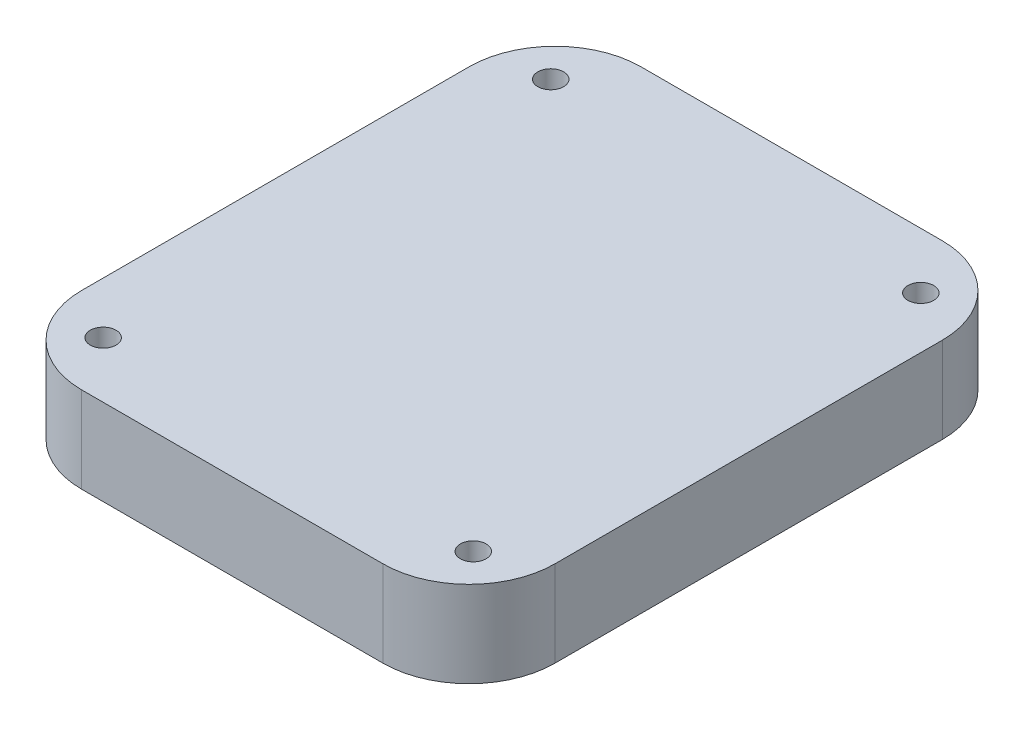
ISO-10303-21;
HEADER;
FILE_DESCRIPTION(('STEP AP214'),'2;1');
FILE_NAME('part.step','',(''),(''),'','','');
FILE_SCHEMA(('AUTOMOTIVE_DESIGN { 1 0 10303 214 1 1 1 1 }'));
ENDSEC;
DATA;
#1=APPLICATION_CONTEXT('core data for automotive mechanical design processes');
#2=APPLICATION_PROTOCOL_DEFINITION('international standard','automotive_design',2000,#1);
#3=PRODUCT_CONTEXT('',#1,'mechanical');
#4=PRODUCT('Part','Part','',(#3));
#5=PRODUCT_RELATED_PRODUCT_CATEGORY('part','',(#4));
#6=PRODUCT_DEFINITION_FORMATION('','',#4);
#7=PRODUCT_DEFINITION_CONTEXT('part definition',#1,'design');
#8=PRODUCT_DEFINITION('design','',#6,#7);
#9=PRODUCT_DEFINITION_SHAPE('','',#8);
#10=(LENGTH_UNIT() NAMED_UNIT(*) SI_UNIT(.MILLI.,.METRE.));
#11=(NAMED_UNIT(*) PLANE_ANGLE_UNIT() SI_UNIT($,.RADIAN.));
#12=(NAMED_UNIT(*) SI_UNIT($,.STERADIAN.) SOLID_ANGLE_UNIT());
#13=UNCERTAINTY_MEASURE_WITH_UNIT(LENGTH_MEASURE(1.E-05),#10,'distance_accuracy_value','');
#14=(GEOMETRIC_REPRESENTATION_CONTEXT(3) GLOBAL_UNCERTAINTY_ASSIGNED_CONTEXT((#13)) GLOBAL_UNIT_ASSIGNED_CONTEXT((#10,
#11,#12)) REPRESENTATION_CONTEXT('',''));
#15=CARTESIAN_POINT('',(0.,0.,0.));
#16=DIRECTION('',(0.,0.,1.));
#17=DIRECTION('',(1.,0.,0.));
#18=AXIS2_PLACEMENT_3D('',#15,#16,#17);
#19=CARTESIAN_POINT('',(-17.5,10.,-22.5));
#20=DIRECTION('',(0.,-1.,0.));
#21=DIRECTION('',(0.,0.,-1.));
#22=AXIS2_PLACEMENT_3D('',#19,#20,#21);
#23=CYLINDRICAL_SURFACE('',#22,10.);
#24=CARTESIAN_POINT('',(-17.5,0.,-22.5));
#25=DIRECTION('',(0.,1.,0.));
#26=DIRECTION('',(0.,0.,1.));
#27=AXIS2_PLACEMENT_3D('',#24,#25,#26);
#28=CIRCLE('',#27,10.);
#29=CARTESIAN_POINT('',(-17.5,0.,-32.5));
#30=VERTEX_POINT('',#29);
#31=CARTESIAN_POINT('',(-27.5,0.,-22.5));
#32=VERTEX_POINT('',#31);
#33=EDGE_CURVE('E129',#30,#32,#28,.T.);
#34=ORIENTED_EDGE('',*,*,#33,.T.);
#35=DIRECTION('',(0.,-1.,0.));
#36=VECTOR('',#35,1.);
#37=CARTESIAN_POINT('',(-27.5,10.,-22.5));
#38=LINE('',#37,#36);
#39=CARTESIAN_POINT('',(-27.5,10.,-22.5));
#40=VERTEX_POINT('',#39);
#41=EDGE_CURVE('E11',#40,#32,#38,.T.);
#42=ORIENTED_EDGE('',*,*,#41,.F.);
#43=CARTESIAN_POINT('',(-17.5,10.,-22.5));
#44=DIRECTION('',(0.,1.,0.));
#45=DIRECTION('',(0.,0.,1.));
#46=AXIS2_PLACEMENT_3D('',#43,#44,#45);
#47=CIRCLE('',#46,10.);
#48=CARTESIAN_POINT('',(-17.5,10.,-32.5));
#49=VERTEX_POINT('',#48);
#50=EDGE_CURVE('E147',#49,#40,#47,.T.);
#51=ORIENTED_EDGE('',*,*,#50,.F.);
#52=DIRECTION('',(0.,-1.,0.));
#53=VECTOR('',#52,1.);
#54=CARTESIAN_POINT('',(-17.5,10.,-32.5));
#55=LINE('',#54,#53);
#56=EDGE_CURVE('E49',#49,#30,#55,.T.);
#57=ORIENTED_EDGE('',*,*,#56,.T.);
#58=EDGE_LOOP('',(#34,#42,#51,#57));
#59=FACE_BOUND('',#58,.T.);
#60=ADVANCED_FACE('F33',(#59),#23,.T.);
#61=CARTESIAN_POINT('',(-27.5,10.,-22.5));
#62=DIRECTION('',(1.,0.,0.));
#63=DIRECTION('',(0.,0.,-1.));
#64=AXIS2_PLACEMENT_3D('',#61,#62,#63);
#65=PLANE('',#64);
#66=DIRECTION('',(0.,0.,1.));
#67=VECTOR('',#66,1.);
#68=CARTESIAN_POINT('',(-27.5,0.,-22.5));
#69=LINE('',#68,#67);
#70=CARTESIAN_POINT('',(-27.5,0.,22.5));
#71=VERTEX_POINT('',#70);
#72=EDGE_CURVE('E131',#32,#71,#69,.T.);
#73=ORIENTED_EDGE('',*,*,#72,.T.);
#74=DIRECTION('',(0.,-1.,0.));
#75=VECTOR('',#74,1.);
#76=CARTESIAN_POINT('',(-27.5,10.,22.5));
#77=LINE('',#76,#75);
#78=CARTESIAN_POINT('',(-27.5,10.,22.5));
#79=VERTEX_POINT('',#78);
#80=EDGE_CURVE('E41',#79,#71,#77,.T.);
#81=ORIENTED_EDGE('',*,*,#80,.F.);
#82=DIRECTION('',(0.,0.,1.));
#83=VECTOR('',#82,1.);
#84=CARTESIAN_POINT('',(-27.5,10.,-22.5));
#85=LINE('',#84,#83);
#86=EDGE_CURVE('E87',#40,#79,#85,.T.);
#87=ORIENTED_EDGE('',*,*,#86,.F.);
#88=ORIENTED_EDGE('',*,*,#41,.T.);
#89=EDGE_LOOP('',(#73,#81,#87,#88));
#90=FACE_BOUND('',#89,.T.);
#91=ADVANCED_FACE('F231',(#90),#65,.F.);
#92=CARTESIAN_POINT('',(-17.5,10.,22.5));
#93=DIRECTION('',(0.,-1.,0.));
#94=DIRECTION('',(0.,0.,-1.));
#95=AXIS2_PLACEMENT_3D('',#92,#93,#94);
#96=CYLINDRICAL_SURFACE('',#95,10.);
#97=CARTESIAN_POINT('',(-17.5,0.,22.5));
#98=DIRECTION('',(0.,1.,0.));
#99=DIRECTION('',(0.,0.,1.));
#100=AXIS2_PLACEMENT_3D('',#97,#98,#99);
#101=CIRCLE('',#100,10.);
#102=CARTESIAN_POINT('',(-17.5,0.,32.5));
#103=VERTEX_POINT('',#102);
#104=EDGE_CURVE('E134',#71,#103,#101,.T.);
#105=ORIENTED_EDGE('',*,*,#104,.T.);
#106=DIRECTION('',(0.,-1.,0.));
#107=VECTOR('',#106,1.);
#108=CARTESIAN_POINT('',(-17.5,10.,32.5));
#109=LINE('',#108,#107);
#110=CARTESIAN_POINT('',(-17.5,10.,32.5));
#111=VERTEX_POINT('',#110);
#112=EDGE_CURVE('E154',#111,#103,#109,.T.);
#113=ORIENTED_EDGE('',*,*,#112,.F.);
#114=CARTESIAN_POINT('',(-17.5,10.,22.5));
#115=DIRECTION('',(0.,1.,0.));
#116=DIRECTION('',(0.,0.,1.));
#117=AXIS2_PLACEMENT_3D('',#114,#115,#116);
#118=CIRCLE('',#117,10.);
#119=EDGE_CURVE('E162',#79,#111,#118,.T.);
#120=ORIENTED_EDGE('',*,*,#119,.F.);
#121=ORIENTED_EDGE('',*,*,#80,.T.);
#122=EDGE_LOOP('',(#105,#113,#120,#121));
#123=FACE_BOUND('',#122,.T.);
#124=ADVANCED_FACE('F160',(#123),#96,.T.);
#125=CARTESIAN_POINT('',(-17.5,10.,32.5));
#126=DIRECTION('',(0.,0.,-1.));
#127=DIRECTION('',(-1.,0.,0.));
#128=AXIS2_PLACEMENT_3D('',#125,#126,#127);
#129=PLANE('',#128);
#130=DIRECTION('',(1.,0.,0.));
#131=VECTOR('',#130,1.);
#132=CARTESIAN_POINT('',(-17.5,0.,32.5));
#133=LINE('',#132,#131);
#134=CARTESIAN_POINT('',(17.5,0.,32.5));
#135=VERTEX_POINT('',#134);
#136=EDGE_CURVE('E136',#103,#135,#133,.T.);
#137=ORIENTED_EDGE('',*,*,#136,.T.);
#138=DIRECTION('',(0.,-1.,0.));
#139=VECTOR('',#138,1.);
#140=CARTESIAN_POINT('',(17.5,10.,32.5));
#141=LINE('',#140,#139);
#142=CARTESIAN_POINT('',(17.5,10.,32.5));
#143=VERTEX_POINT('',#142);
#144=EDGE_CURVE('E151',#143,#135,#141,.T.);
#145=ORIENTED_EDGE('',*,*,#144,.F.);
#146=DIRECTION('',(1.,0.,0.));
#147=VECTOR('',#146,1.);
#148=CARTESIAN_POINT('',(-17.5,10.,32.5));
#149=LINE('',#148,#147);
#150=EDGE_CURVE('E173',#111,#143,#149,.T.);
#151=ORIENTED_EDGE('',*,*,#150,.F.);
#152=ORIENTED_EDGE('',*,*,#112,.T.);
#153=EDGE_LOOP('',(#137,#145,#151,#152));
#154=FACE_BOUND('',#153,.T.);
#155=ADVANCED_FACE('F169',(#154),#129,.F.);
#156=CARTESIAN_POINT('',(17.5,10.,22.5));
#157=DIRECTION('',(0.,-1.,0.));
#158=DIRECTION('',(0.,0.,-1.));
#159=AXIS2_PLACEMENT_3D('',#156,#157,#158);
#160=CYLINDRICAL_SURFACE('',#159,10.);
#161=CARTESIAN_POINT('',(17.5,0.,22.5));
#162=DIRECTION('',(0.,1.,0.));
#163=DIRECTION('',(0.,0.,1.));
#164=AXIS2_PLACEMENT_3D('',#161,#162,#163);
#165=CIRCLE('',#164,10.);
#166=CARTESIAN_POINT('',(27.5,0.,22.5));
#167=VERTEX_POINT('',#166);
#168=EDGE_CURVE('E138',#135,#167,#165,.T.);
#169=ORIENTED_EDGE('',*,*,#168,.T.);
#170=DIRECTION('',(0.,-1.,0.));
#171=VECTOR('',#170,1.);
#172=CARTESIAN_POINT('',(27.5,10.,22.5));
#173=LINE('',#172,#171);
#174=CARTESIAN_POINT('',(27.5,10.,22.5));
#175=VERTEX_POINT('',#174);
#176=EDGE_CURVE('E112',#175,#167,#173,.T.);
#177=ORIENTED_EDGE('',*,*,#176,.F.);
#178=CARTESIAN_POINT('',(17.5,10.,22.5));
#179=DIRECTION('',(0.,1.,0.));
#180=DIRECTION('',(0.,0.,1.));
#181=AXIS2_PLACEMENT_3D('',#178,#179,#180);
#182=CIRCLE('',#181,10.);
#183=EDGE_CURVE('E120',#143,#175,#182,.T.);
#184=ORIENTED_EDGE('',*,*,#183,.F.);
#185=ORIENTED_EDGE('',*,*,#144,.T.);
#186=EDGE_LOOP('',(#169,#177,#184,#185));
#187=FACE_BOUND('',#186,.T.);
#188=ADVANCED_FACE('F172',(#187),#160,.T.);
#189=CARTESIAN_POINT('',(27.5,10.,-22.5));
#190=DIRECTION('',(1.,0.,0.));
#191=DIRECTION('',(0.,0.,-1.));
#192=AXIS2_PLACEMENT_3D('',#189,#190,#191);
#193=PLANE('',#192);
#194=DIRECTION('',(0.,0.,1.));
#195=VECTOR('',#194,1.);
#196=CARTESIAN_POINT('',(27.5,0.,-22.5));
#197=LINE('',#196,#195);
#198=CARTESIAN_POINT('',(27.5,0.,-22.5));
#199=VERTEX_POINT('',#198);
#200=EDGE_CURVE('E108',#199,#167,#197,.T.);
#201=ORIENTED_EDGE('',*,*,#200,.F.);
#202=DIRECTION('',(0.,-1.,0.));
#203=VECTOR('',#202,1.);
#204=CARTESIAN_POINT('',(27.5,10.,-22.5));
#205=LINE('',#204,#203);
#206=CARTESIAN_POINT('',(27.5,10.,-22.5));
#207=VERTEX_POINT('',#206);
#208=EDGE_CURVE('E103',#207,#199,#205,.T.);
#209=ORIENTED_EDGE('',*,*,#208,.F.);
#210=DIRECTION('',(0.,0.,1.));
#211=VECTOR('',#210,1.);
#212=CARTESIAN_POINT('',(27.5,10.,-22.5));
#213=LINE('',#212,#211);
#214=EDGE_CURVE('E106',#207,#175,#213,.T.);
#215=ORIENTED_EDGE('',*,*,#214,.T.);
#216=ORIENTED_EDGE('',*,*,#176,.T.);
#217=EDGE_LOOP('',(#201,#209,#215,#216));
#218=FACE_BOUND('',#217,.T.);
#219=ADVANCED_FACE('F105',(#218),#193,.T.);
#220=CARTESIAN_POINT('',(17.5,10.,-22.5));
#221=DIRECTION('',(0.,-1.,0.));
#222=DIRECTION('',(0.,0.,-1.));
#223=AXIS2_PLACEMENT_3D('',#220,#221,#222);
#224=CYLINDRICAL_SURFACE('',#223,10.);
#225=CARTESIAN_POINT('',(17.5,0.,-22.5));
#226=DIRECTION('',(0.,-1.,0.));
#227=DIRECTION('',(0.,0.,-1.));
#228=AXIS2_PLACEMENT_3D('',#225,#226,#227);
#229=CIRCLE('',#228,10.);
#230=CARTESIAN_POINT('',(17.5,0.,-32.5));
#231=VERTEX_POINT('',#230);
#232=EDGE_CURVE('E142',#231,#199,#229,.T.);
#233=ORIENTED_EDGE('',*,*,#232,.F.);
#234=DIRECTION('',(0.,-1.,0.));
#235=VECTOR('',#234,1.);
#236=CARTESIAN_POINT('',(17.5,10.,-32.5));
#237=LINE('',#236,#235);
#238=CARTESIAN_POINT('',(17.5,10.,-32.5));
#239=VERTEX_POINT('',#238);
#240=EDGE_CURVE('E75',#239,#231,#237,.T.);
#241=ORIENTED_EDGE('',*,*,#240,.F.);
#242=CARTESIAN_POINT('',(17.5,10.,-22.5));
#243=DIRECTION('',(0.,-1.,0.));
#244=DIRECTION('',(0.,0.,-1.));
#245=AXIS2_PLACEMENT_3D('',#242,#243,#244);
#246=CIRCLE('',#245,10.);
#247=EDGE_CURVE('E118',#239,#207,#246,.T.);
#248=ORIENTED_EDGE('',*,*,#247,.T.);
#249=ORIENTED_EDGE('',*,*,#208,.T.);
#250=EDGE_LOOP('',(#233,#241,#248,#249));
#251=FACE_BOUND('',#250,.T.);
#252=ADVANCED_FACE('F123',(#251),#224,.T.);
#253=CARTESIAN_POINT('',(-17.5,10.,-32.5));
#254=DIRECTION('',(0.,0.,-1.));
#255=DIRECTION('',(-1.,0.,0.));
#256=AXIS2_PLACEMENT_3D('',#253,#254,#255);
#257=PLANE('',#256);
#258=DIRECTION('',(1.,0.,0.));
#259=VECTOR('',#258,1.);
#260=CARTESIAN_POINT('',(-17.5,0.,-32.5));
#261=LINE('',#260,#259);
#262=EDGE_CURVE('E144',#30,#231,#261,.T.);
#263=ORIENTED_EDGE('',*,*,#262,.F.);
#264=ORIENTED_EDGE('',*,*,#56,.F.);
#265=DIRECTION('',(1.,0.,0.));
#266=VECTOR('',#265,1.);
#267=CARTESIAN_POINT('',(-17.5,10.,-32.5));
#268=LINE('',#267,#266);
#269=EDGE_CURVE('E124',#49,#239,#268,.T.);
#270=ORIENTED_EDGE('',*,*,#269,.T.);
#271=ORIENTED_EDGE('',*,*,#240,.T.);
#272=EDGE_LOOP('',(#263,#264,#270,#271));
#273=FACE_BOUND('',#272,.T.);
#274=ADVANCED_FACE('F215',(#273),#257,.T.);
#275=CARTESIAN_POINT('',(-17.5,10.,-22.5));
#276=DIRECTION('',(0.,1.,0.));
#277=DIRECTION('',(0.,0.,1.));
#278=AXIS2_PLACEMENT_3D('',#275,#276,#277);
#279=PLANE('',#278);
#280=CARTESIAN_POINT('',(-21.4999999999995,10.,26.));
#281=DIRECTION('',(0.,1.,0.));
#282=DIRECTION('',(0.,0.,1.));
#283=AXIS2_PLACEMENT_3D('',#280,#281,#282);
#284=CIRCLE('',#283,1.5);
#285=CARTESIAN_POINT('',(-21.4999999999995,10.,27.5));
#286=VERTEX_POINT('',#285);
#287=EDGE_CURVE('E185',#286,#286,#284,.T.);
#288=ORIENTED_EDGE('',*,*,#287,.F.);
#289=EDGE_LOOP('',(#288));
#290=FACE_BOUND('',#289,.T.);
#291=CARTESIAN_POINT('',(21.5000000000005,10.,26.));
#292=DIRECTION('',(0.,1.,0.));
#293=DIRECTION('',(0.,0.,1.));
#294=AXIS2_PLACEMENT_3D('',#291,#292,#293);
#295=CIRCLE('',#294,1.5);
#296=CARTESIAN_POINT('',(21.5000000000005,10.,27.5));
#297=VERTEX_POINT('',#296);
#298=EDGE_CURVE('E191',#297,#297,#295,.T.);
#299=ORIENTED_EDGE('',*,*,#298,.F.);
#300=EDGE_LOOP('',(#299));
#301=FACE_BOUND('',#300,.T.);
#302=CARTESIAN_POINT('',(21.5,10.,-26.));
#303=DIRECTION('',(0.,1.,0.));
#304=DIRECTION('',(0.,0.,1.));
#305=AXIS2_PLACEMENT_3D('',#302,#303,#304);
#306=CIRCLE('',#305,1.5);
#307=CARTESIAN_POINT('',(21.5,10.,-24.5));
#308=VERTEX_POINT('',#307);
#309=EDGE_CURVE('E197',#308,#308,#306,.T.);
#310=ORIENTED_EDGE('',*,*,#309,.F.);
#311=EDGE_LOOP('',(#310));
#312=FACE_BOUND('',#311,.T.);
#313=CARTESIAN_POINT('',(-21.5,10.,-26.));
#314=DIRECTION('',(0.,1.,0.));
#315=DIRECTION('',(0.,0.,1.));
#316=AXIS2_PLACEMENT_3D('',#313,#314,#315);
#317=CIRCLE('',#316,1.5);
#318=CARTESIAN_POINT('',(-21.5,10.,-24.5));
#319=VERTEX_POINT('',#318);
#320=EDGE_CURVE('E179',#319,#319,#317,.T.);
#321=ORIENTED_EDGE('',*,*,#320,.F.);
#322=EDGE_LOOP('',(#321));
#323=FACE_BOUND('',#322,.T.);
#324=ORIENTED_EDGE('',*,*,#50,.T.);
#325=ORIENTED_EDGE('',*,*,#86,.T.);
#326=ORIENTED_EDGE('',*,*,#119,.T.);
#327=ORIENTED_EDGE('',*,*,#150,.T.);
#328=ORIENTED_EDGE('',*,*,#183,.T.);
#329=ORIENTED_EDGE('',*,*,#214,.F.);
#330=ORIENTED_EDGE('',*,*,#247,.F.);
#331=ORIENTED_EDGE('',*,*,#269,.F.);
#332=EDGE_LOOP('',(#324,#325,#326,#327,#328,#329,#330,#331));
#333=FACE_BOUND('',#332,.T.);
#334=ADVANCED_FACE('F116',(#290,#301,#312,#323,#333),#279,.T.);
#335=CARTESIAN_POINT('',(-17.5,0.,-22.5));
#336=DIRECTION('',(0.,1.,0.));
#337=DIRECTION('',(0.,0.,1.));
#338=AXIS2_PLACEMENT_3D('',#335,#336,#337);
#339=PLANE('',#338);
#340=CARTESIAN_POINT('',(-21.4999999999995,0.,26.));
#341=DIRECTION('',(0.,1.,0.));
#342=DIRECTION('',(0.,0.,1.));
#343=AXIS2_PLACEMENT_3D('',#340,#341,#342);
#344=CIRCLE('',#343,1.5);
#345=CARTESIAN_POINT('',(-21.4999999999995,0.,27.5));
#346=VERTEX_POINT('',#345);
#347=EDGE_CURVE('E188',#346,#346,#344,.T.);
#348=ORIENTED_EDGE('',*,*,#347,.T.);
#349=EDGE_LOOP('',(#348));
#350=FACE_BOUND('',#349,.T.);
#351=CARTESIAN_POINT('',(21.5000000000005,0.,26.));
#352=DIRECTION('',(0.,1.,0.));
#353=DIRECTION('',(0.,0.,1.));
#354=AXIS2_PLACEMENT_3D('',#351,#352,#353);
#355=CIRCLE('',#354,1.5);
#356=CARTESIAN_POINT('',(21.5000000000005,0.,27.5));
#357=VERTEX_POINT('',#356);
#358=EDGE_CURVE('E194',#357,#357,#355,.T.);
#359=ORIENTED_EDGE('',*,*,#358,.T.);
#360=EDGE_LOOP('',(#359));
#361=FACE_BOUND('',#360,.T.);
#362=CARTESIAN_POINT('',(21.5,0.,-26.));
#363=DIRECTION('',(0.,1.,0.));
#364=DIRECTION('',(0.,0.,1.));
#365=AXIS2_PLACEMENT_3D('',#362,#363,#364);
#366=CIRCLE('',#365,1.5);
#367=CARTESIAN_POINT('',(21.5,0.,-24.5));
#368=VERTEX_POINT('',#367);
#369=EDGE_CURVE('E182',#368,#368,#366,.T.);
#370=ORIENTED_EDGE('',*,*,#369,.T.);
#371=EDGE_LOOP('',(#370));
#372=FACE_BOUND('',#371,.T.);
#373=CARTESIAN_POINT('',(-21.5,0.,-26.));
#374=DIRECTION('',(0.,1.,0.));
#375=DIRECTION('',(0.,0.,1.));
#376=AXIS2_PLACEMENT_3D('',#373,#374,#375);
#377=CIRCLE('',#376,1.5);
#378=CARTESIAN_POINT('',(-21.5,0.,-24.5));
#379=VERTEX_POINT('',#378);
#380=EDGE_CURVE('E132',#379,#379,#377,.T.);
#381=ORIENTED_EDGE('',*,*,#380,.T.);
#382=EDGE_LOOP('',(#381));
#383=FACE_BOUND('',#382,.T.);
#384=ORIENTED_EDGE('',*,*,#33,.F.);
#385=ORIENTED_EDGE('',*,*,#262,.T.);
#386=ORIENTED_EDGE('',*,*,#232,.T.);
#387=ORIENTED_EDGE('',*,*,#200,.T.);
#388=ORIENTED_EDGE('',*,*,#168,.F.);
#389=ORIENTED_EDGE('',*,*,#136,.F.);
#390=ORIENTED_EDGE('',*,*,#104,.F.);
#391=ORIENTED_EDGE('',*,*,#72,.F.);
#392=EDGE_LOOP('',(#384,#385,#386,#387,#388,#389,#390,#391));
#393=FACE_BOUND('',#392,.T.);
#394=ADVANCED_FACE('F165',(#350,#361,#372,#383,#393),#339,.F.);
#395=CARTESIAN_POINT('',(-21.5,0.,-26.));
#396=DIRECTION('',(0.,1.,0.));
#397=DIRECTION('',(0.,0.,1.));
#398=AXIS2_PLACEMENT_3D('',#395,#396,#397);
#399=CYLINDRICAL_SURFACE('',#398,1.5);
#400=ORIENTED_EDGE('',*,*,#380,.F.);
#401=EDGE_LOOP('',(#400));
#402=FACE_BOUND('',#401,.T.);
#403=ORIENTED_EDGE('',*,*,#320,.T.);
#404=EDGE_LOOP('',(#403));
#405=FACE_BOUND('',#404,.T.);
#406=ADVANCED_FACE('F209',(#402,#405),#399,.F.);
#407=CARTESIAN_POINT('',(21.5,0.,-26.));
#408=DIRECTION('',(0.,1.,0.));
#409=DIRECTION('',(0.,0.,1.));
#410=AXIS2_PLACEMENT_3D('',#407,#408,#409);
#411=CYLINDRICAL_SURFACE('',#410,1.5);
#412=ORIENTED_EDGE('',*,*,#369,.F.);
#413=EDGE_LOOP('',(#412));
#414=FACE_BOUND('',#413,.T.);
#415=ORIENTED_EDGE('',*,*,#309,.T.);
#416=EDGE_LOOP('',(#415));
#417=FACE_BOUND('',#416,.T.);
#418=ADVANCED_FACE('F205',(#414,#417),#411,.F.);
#419=CARTESIAN_POINT('',(21.5000000000005,0.,26.));
#420=DIRECTION('',(0.,1.,0.));
#421=DIRECTION('',(0.,0.,1.));
#422=AXIS2_PLACEMENT_3D('',#419,#420,#421);
#423=CYLINDRICAL_SURFACE('',#422,1.5);
#424=ORIENTED_EDGE('',*,*,#358,.F.);
#425=EDGE_LOOP('',(#424));
#426=FACE_BOUND('',#425,.T.);
#427=ORIENTED_EDGE('',*,*,#298,.T.);
#428=EDGE_LOOP('',(#427));
#429=FACE_BOUND('',#428,.T.);
#430=ADVANCED_FACE('F208',(#426,#429),#423,.F.);
#431=CARTESIAN_POINT('',(-21.4999999999995,0.,26.));
#432=DIRECTION('',(0.,1.,0.));
#433=DIRECTION('',(0.,0.,1.));
#434=AXIS2_PLACEMENT_3D('',#431,#432,#433);
#435=CYLINDRICAL_SURFACE('',#434,1.5);
#436=ORIENTED_EDGE('',*,*,#347,.F.);
#437=EDGE_LOOP('',(#436));
#438=FACE_BOUND('',#437,.T.);
#439=ORIENTED_EDGE('',*,*,#287,.T.);
#440=EDGE_LOOP('',(#439));
#441=FACE_BOUND('',#440,.T.);
#442=ADVANCED_FACE('F305',(#438,#441),#435,.F.);
#443=CLOSED_SHELL('',(#60,#91,#124,#155,#188,#219,#252,#274,#334,#394,#406,#418,#430,#442));
#444=MANIFOLD_SOLID_BREP('B2',#443);
#445=ADVANCED_BREP_SHAPE_REPRESENTATION('',(#18,#444),#14);
#446=SHAPE_DEFINITION_REPRESENTATION(#9,#445);
ENDSEC;
END-ISO-10303-21;
